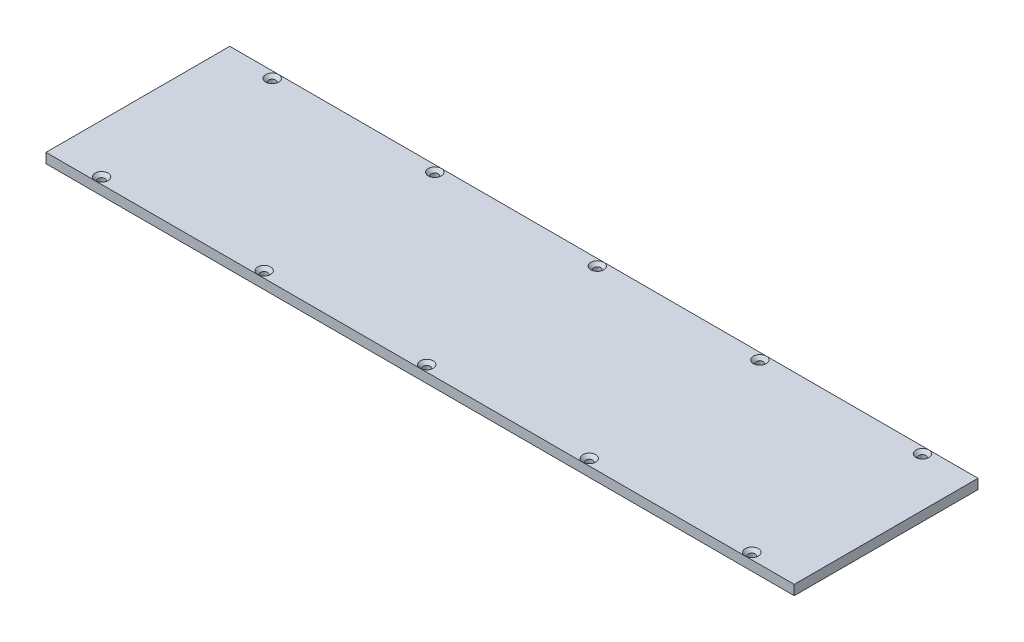
ISO-10303-21;
HEADER;
FILE_DESCRIPTION(('STEP AP214'),'2;1');
FILE_NAME('part.step','',(''),(''),'','','');
FILE_SCHEMA(('AUTOMOTIVE_DESIGN { 1 0 10303 214 1 1 1 1 }'));
ENDSEC;
DATA;
#1=APPLICATION_CONTEXT('core data for automotive mechanical design processes');
#2=APPLICATION_PROTOCOL_DEFINITION('international standard','automotive_design',2000,#1);
#3=PRODUCT_CONTEXT('',#1,'mechanical');
#4=PRODUCT('Part','Part','',(#3));
#5=PRODUCT_RELATED_PRODUCT_CATEGORY('part','',(#4));
#6=PRODUCT_DEFINITION_FORMATION('','',#4);
#7=PRODUCT_DEFINITION_CONTEXT('part definition',#1,'design');
#8=PRODUCT_DEFINITION('design','',#6,#7);
#9=PRODUCT_DEFINITION_SHAPE('','',#8);
#10=(LENGTH_UNIT() NAMED_UNIT(*) SI_UNIT(.MILLI.,.METRE.));
#11=(NAMED_UNIT(*) PLANE_ANGLE_UNIT() SI_UNIT($,.RADIAN.));
#12=(NAMED_UNIT(*) SI_UNIT($,.STERADIAN.) SOLID_ANGLE_UNIT());
#13=UNCERTAINTY_MEASURE_WITH_UNIT(LENGTH_MEASURE(1.E-05),#10,'distance_accuracy_value','');
#14=(GEOMETRIC_REPRESENTATION_CONTEXT(3) GLOBAL_UNCERTAINTY_ASSIGNED_CONTEXT((#13)) GLOBAL_UNIT_ASSIGNED_CONTEXT((#10,
#11,#12)) REPRESENTATION_CONTEXT('',''));
#15=CARTESIAN_POINT('',(0.,0.,0.));
#16=DIRECTION('',(0.,0.,1.));
#17=DIRECTION('',(1.,0.,0.));
#18=AXIS2_PLACEMENT_3D('',#15,#16,#17);
#19=CARTESIAN_POINT('',(361.95,9.525,88.9));
#20=DIRECTION('',(-1.,0.,0.));
#21=DIRECTION('',(0.,0.,1.));
#22=AXIS2_PLACEMENT_3D('',#19,#20,#21);
#23=PLANE('',#22);
#24=DIRECTION('',(0.,0.,-1.));
#25=VECTOR('',#24,1.);
#26=CARTESIAN_POINT('',(361.95,0.,88.9));
#27=LINE('',#26,#25);
#28=CARTESIAN_POINT('',(361.95,0.,88.9));
#29=VERTEX_POINT('',#28);
#30=CARTESIAN_POINT('',(361.95,0.,-88.9));
#31=VERTEX_POINT('',#30);
#32=EDGE_CURVE('E116',#29,#31,#27,.T.);
#33=ORIENTED_EDGE('',*,*,#32,.T.);
#34=DIRECTION('',(0.,-1.,0.));
#35=VECTOR('',#34,1.);
#36=CARTESIAN_POINT('',(361.95,9.525,-88.9));
#37=LINE('',#36,#35);
#38=CARTESIAN_POINT('',(361.95,9.525,-88.9));
#39=VERTEX_POINT('',#38);
#40=EDGE_CURVE('E11',#39,#31,#37,.T.);
#41=ORIENTED_EDGE('',*,*,#40,.F.);
#42=DIRECTION('',(0.,0.,-1.));
#43=VECTOR('',#42,1.);
#44=CARTESIAN_POINT('',(361.95,9.525,88.9));
#45=LINE('',#44,#43);
#46=CARTESIAN_POINT('',(361.95,9.525,88.9));
#47=VERTEX_POINT('',#46);
#48=EDGE_CURVE('E99',#47,#39,#45,.T.);
#49=ORIENTED_EDGE('',*,*,#48,.F.);
#50=DIRECTION('',(0.,-1.,0.));
#51=VECTOR('',#50,1.);
#52=CARTESIAN_POINT('',(361.95,9.525,88.9));
#53=LINE('',#52,#51);
#54=EDGE_CURVE('E112',#47,#29,#53,.T.);
#55=ORIENTED_EDGE('',*,*,#54,.T.);
#56=EDGE_LOOP('',(#33,#41,#49,#55));
#57=FACE_BOUND('',#56,.T.);
#58=ADVANCED_FACE('F47',(#57),#23,.F.);
#59=CARTESIAN_POINT('',(-361.95,9.525,-88.9));
#60=DIRECTION('',(0.,0.,1.));
#61=DIRECTION('',(1.,0.,0.));
#62=AXIS2_PLACEMENT_3D('',#59,#60,#61);
#63=PLANE('',#62);
#64=DIRECTION('',(-1.,0.,0.));
#65=VECTOR('',#64,1.);
#66=CARTESIAN_POINT('',(-361.95,0.,-88.9));
#67=LINE('',#66,#65);
#68=CARTESIAN_POINT('',(-361.95,0.,-88.9));
#69=VERTEX_POINT('',#68);
#70=EDGE_CURVE('E104',#31,#69,#67,.T.);
#71=ORIENTED_EDGE('',*,*,#70,.T.);
#72=DIRECTION('',(0.,-1.,0.));
#73=VECTOR('',#72,1.);
#74=CARTESIAN_POINT('',(-361.95,9.525,-88.9));
#75=LINE('',#74,#73);
#76=CARTESIAN_POINT('',(-361.95,9.525,-88.9));
#77=VERTEX_POINT('',#76);
#78=EDGE_CURVE('E56',#77,#69,#75,.T.);
#79=ORIENTED_EDGE('',*,*,#78,.F.);
#80=DIRECTION('',(-1.,0.,0.));
#81=VECTOR('',#80,1.);
#82=CARTESIAN_POINT('',(-361.95,9.525,-88.9));
#83=LINE('',#82,#81);
#84=EDGE_CURVE('E94',#39,#77,#83,.T.);
#85=ORIENTED_EDGE('',*,*,#84,.F.);
#86=ORIENTED_EDGE('',*,*,#40,.T.);
#87=EDGE_LOOP('',(#71,#79,#85,#86));
#88=FACE_BOUND('',#87,.T.);
#89=ADVANCED_FACE('F103',(#88),#63,.F.);
#90=CARTESIAN_POINT('',(-361.95,9.525,88.9));
#91=DIRECTION('',(1.,0.,0.));
#92=DIRECTION('',(0.,0.,-1.));
#93=AXIS2_PLACEMENT_3D('',#90,#91,#92);
#94=PLANE('',#93);
#95=DIRECTION('',(0.,0.,1.));
#96=VECTOR('',#95,1.);
#97=CARTESIAN_POINT('',(-361.95,0.,88.9));
#98=LINE('',#97,#96);
#99=CARTESIAN_POINT('',(-361.95,0.,88.9));
#100=VERTEX_POINT('',#99);
#101=EDGE_CURVE('E81',#69,#100,#98,.T.);
#102=ORIENTED_EDGE('',*,*,#101,.T.);
#103=DIRECTION('',(0.,-1.,0.));
#104=VECTOR('',#103,1.);
#105=CARTESIAN_POINT('',(-361.95,9.525,88.9));
#106=LINE('',#105,#104);
#107=CARTESIAN_POINT('',(-361.95,9.525,88.9));
#108=VERTEX_POINT('',#107);
#109=EDGE_CURVE('E106',#108,#100,#106,.T.);
#110=ORIENTED_EDGE('',*,*,#109,.F.);
#111=DIRECTION('',(0.,0.,1.));
#112=VECTOR('',#111,1.);
#113=CARTESIAN_POINT('',(-361.95,9.525,88.9));
#114=LINE('',#113,#112);
#115=EDGE_CURVE('E97',#77,#108,#114,.T.);
#116=ORIENTED_EDGE('',*,*,#115,.F.);
#117=ORIENTED_EDGE('',*,*,#78,.T.);
#118=EDGE_LOOP('',(#102,#110,#116,#117));
#119=FACE_BOUND('',#118,.T.);
#120=ADVANCED_FACE('F107',(#119),#94,.F.);
#121=CARTESIAN_POINT('',(-361.95,9.525,88.9));
#122=DIRECTION('',(0.,0.,-1.));
#123=DIRECTION('',(-1.,0.,0.));
#124=AXIS2_PLACEMENT_3D('',#121,#122,#123);
#125=PLANE('',#124);
#126=DIRECTION('',(1.,0.,0.));
#127=VECTOR('',#126,1.);
#128=CARTESIAN_POINT('',(-361.95,0.,88.9));
#129=LINE('',#128,#127);
#130=EDGE_CURVE('E87',#100,#29,#129,.T.);
#131=ORIENTED_EDGE('',*,*,#130,.T.);
#132=ORIENTED_EDGE('',*,*,#54,.F.);
#133=DIRECTION('',(1.,0.,0.));
#134=VECTOR('',#133,1.);
#135=CARTESIAN_POINT('',(-361.95,9.525,88.9));
#136=LINE('',#135,#134);
#137=EDGE_CURVE('E64',#108,#47,#136,.T.);
#138=ORIENTED_EDGE('',*,*,#137,.F.);
#139=ORIENTED_EDGE('',*,*,#109,.T.);
#140=EDGE_LOOP('',(#131,#132,#138,#139));
#141=FACE_BOUND('',#140,.T.);
#142=ADVANCED_FACE('F131',(#141),#125,.F.);
#143=CARTESIAN_POINT('',(0.,9.525,0.));
#144=DIRECTION('',(0.,-1.,0.));
#145=DIRECTION('',(0.,0.,-1.));
#146=AXIS2_PLACEMENT_3D('',#143,#144,#145);
#147=PLANE('',#146);
#148=CARTESIAN_POINT('',(-157.2718,9.525,-82.5500000000001));
#149=DIRECTION('',(0.,1.,0.));
#150=DIRECTION('',(0.,0.,1.));
#151=AXIS2_PLACEMENT_3D('',#148,#149,#150);
#152=CIRCLE('',#151,6.3);
#153=CARTESIAN_POINT('',(-157.2718,9.525,-76.2500000000001));
#154=VERTEX_POINT('',#153);
#155=EDGE_CURVE('E254',#154,#154,#152,.T.);
#156=ORIENTED_EDGE('',*,*,#155,.F.);
#157=EDGE_LOOP('',(#156));
#158=FACE_BOUND('',#157,.T.);
#159=CARTESIAN_POINT('',(157.2718,9.525,-82.5500000000001));
#160=DIRECTION('',(0.,1.,0.));
#161=DIRECTION('',(0.,0.,1.));
#162=AXIS2_PLACEMENT_3D('',#159,#160,#161);
#163=CIRCLE('',#162,6.3);
#164=CARTESIAN_POINT('',(157.2718,9.525,-76.2500000000001));
#165=VERTEX_POINT('',#164);
#166=EDGE_CURVE('E242',#165,#165,#163,.T.);
#167=ORIENTED_EDGE('',*,*,#166,.F.);
#168=EDGE_LOOP('',(#167));
#169=FACE_BOUND('',#168,.T.);
#170=CARTESIAN_POINT('',(-157.2718,9.525,82.5500000000001));
#171=DIRECTION('',(0.,1.,0.));
#172=DIRECTION('',(0.,0.,1.));
#173=AXIS2_PLACEMENT_3D('',#170,#171,#172);
#174=CIRCLE('',#173,6.3);
#175=CARTESIAN_POINT('',(-157.2718,9.525,88.8500000000001));
#176=VERTEX_POINT('',#175);
#177=EDGE_CURVE('E230',#176,#176,#174,.T.);
#178=ORIENTED_EDGE('',*,*,#177,.F.);
#179=EDGE_LOOP('',(#178));
#180=FACE_BOUND('',#179,.T.);
#181=CARTESIAN_POINT('',(157.2718,9.525,82.5500000000001));
#182=DIRECTION('',(0.,1.,0.));
#183=DIRECTION('',(0.,0.,1.));
#184=AXIS2_PLACEMENT_3D('',#181,#182,#183);
#185=CIRCLE('',#184,6.3);
#186=CARTESIAN_POINT('',(157.2718,9.525,88.8500000000001));
#187=VERTEX_POINT('',#186);
#188=EDGE_CURVE('E218',#187,#187,#185,.T.);
#189=ORIENTED_EDGE('',*,*,#188,.F.);
#190=EDGE_LOOP('',(#189));
#191=FACE_BOUND('',#190,.T.);
#192=CARTESIAN_POINT('',(314.5436,9.525,82.55));
#193=DIRECTION('',(0.,1.,0.));
#194=DIRECTION('',(0.,0.,1.));
#195=AXIS2_PLACEMENT_3D('',#192,#193,#194);
#196=CIRCLE('',#195,6.30000000000003);
#197=CARTESIAN_POINT('',(314.5436,9.525,88.85));
#198=VERTEX_POINT('',#197);
#199=EDGE_CURVE('E206',#198,#198,#196,.T.);
#200=ORIENTED_EDGE('',*,*,#199,.F.);
#201=EDGE_LOOP('',(#200));
#202=FACE_BOUND('',#201,.T.);
#203=CARTESIAN_POINT('',(-314.5436,9.525,-82.55));
#204=DIRECTION('',(0.,1.,0.));
#205=DIRECTION('',(0.,0.,1.));
#206=AXIS2_PLACEMENT_3D('',#203,#204,#205);
#207=CIRCLE('',#206,6.30000000000003);
#208=CARTESIAN_POINT('',(-314.5436,9.525,-76.25));
#209=VERTEX_POINT('',#208);
#210=EDGE_CURVE('E194',#209,#209,#207,.T.);
#211=ORIENTED_EDGE('',*,*,#210,.F.);
#212=EDGE_LOOP('',(#211));
#213=FACE_BOUND('',#212,.T.);
#214=CARTESIAN_POINT('',(-314.5436,9.525,82.55));
#215=DIRECTION('',(0.,1.,0.));
#216=DIRECTION('',(0.,0.,1.));
#217=AXIS2_PLACEMENT_3D('',#214,#215,#216);
#218=CIRCLE('',#217,6.30000000000003);
#219=CARTESIAN_POINT('',(-314.5436,9.525,88.85));
#220=VERTEX_POINT('',#219);
#221=EDGE_CURVE('E182',#220,#220,#218,.T.);
#222=ORIENTED_EDGE('',*,*,#221,.F.);
#223=EDGE_LOOP('',(#222));
#224=FACE_BOUND('',#223,.T.);
#225=CARTESIAN_POINT('',(0.,9.525,82.55));
#226=DIRECTION('',(0.,1.,0.));
#227=DIRECTION('',(0.,0.,1.));
#228=AXIS2_PLACEMENT_3D('',#225,#226,#227);
#229=CIRCLE('',#228,6.3);
#230=CARTESIAN_POINT('',(0.,9.525,88.85));
#231=VERTEX_POINT('',#230);
#232=EDGE_CURVE('E170',#231,#231,#229,.T.);
#233=ORIENTED_EDGE('',*,*,#232,.F.);
#234=EDGE_LOOP('',(#233));
#235=FACE_BOUND('',#234,.T.);
#236=CARTESIAN_POINT('',(0.,9.525,-82.55));
#237=DIRECTION('',(0.,1.,0.));
#238=DIRECTION('',(0.,0.,1.));
#239=AXIS2_PLACEMENT_3D('',#236,#237,#238);
#240=CIRCLE('',#239,6.3);
#241=CARTESIAN_POINT('',(0.,9.525,-76.25));
#242=VERTEX_POINT('',#241);
#243=EDGE_CURVE('E158',#242,#242,#240,.T.);
#244=ORIENTED_EDGE('',*,*,#243,.F.);
#245=EDGE_LOOP('',(#244));
#246=FACE_BOUND('',#245,.T.);
#247=CARTESIAN_POINT('',(314.5436,9.525,-82.55));
#248=DIRECTION('',(0.,1.,0.));
#249=DIRECTION('',(0.,0.,1.));
#250=AXIS2_PLACEMENT_3D('',#247,#248,#249);
#251=CIRCLE('',#250,6.30000000000003);
#252=CARTESIAN_POINT('',(314.5436,9.525,-76.25));
#253=VERTEX_POINT('',#252);
#254=EDGE_CURVE('E146',#253,#253,#251,.T.);
#255=ORIENTED_EDGE('',*,*,#254,.F.);
#256=EDGE_LOOP('',(#255));
#257=FACE_BOUND('',#256,.T.);
#258=ORIENTED_EDGE('',*,*,#48,.T.);
#259=ORIENTED_EDGE('',*,*,#84,.T.);
#260=ORIENTED_EDGE('',*,*,#115,.T.);
#261=ORIENTED_EDGE('',*,*,#137,.T.);
#262=EDGE_LOOP('',(#258,#259,#260,#261));
#263=FACE_BOUND('',#262,.T.);
#264=ADVANCED_FACE('F95',(#158,#169,#180,#191,#202,#213,#224,#235,#246,#257,#263),#147,.F.);
#265=CARTESIAN_POINT('',(0.,0.,0.));
#266=DIRECTION('',(0.,-1.,0.));
#267=DIRECTION('',(0.,0.,-1.));
#268=AXIS2_PLACEMENT_3D('',#265,#266,#267);
#269=PLANE('',#268);
#270=CARTESIAN_POINT('',(-157.2718,0.,-82.5500000000001));
#271=DIRECTION('',(0.,1.,0.));
#272=DIRECTION('',(0.,0.,1.));
#273=AXIS2_PLACEMENT_3D('',#270,#271,#272);
#274=CIRCLE('',#273,3.3);
#275=CARTESIAN_POINT('',(-157.2718,0.,-79.2500000000001));
#276=VERTEX_POINT('',#275);
#277=EDGE_CURVE('E246',#276,#276,#274,.T.);
#278=ORIENTED_EDGE('',*,*,#277,.T.);
#279=EDGE_LOOP('',(#278));
#280=FACE_BOUND('',#279,.T.);
#281=CARTESIAN_POINT('',(157.2718,0.,-82.5500000000001));
#282=DIRECTION('',(0.,1.,0.));
#283=DIRECTION('',(0.,0.,1.));
#284=AXIS2_PLACEMENT_3D('',#281,#282,#283);
#285=CIRCLE('',#284,3.3);
#286=CARTESIAN_POINT('',(157.2718,0.,-79.2500000000001));
#287=VERTEX_POINT('',#286);
#288=EDGE_CURVE('E234',#287,#287,#285,.T.);
#289=ORIENTED_EDGE('',*,*,#288,.T.);
#290=EDGE_LOOP('',(#289));
#291=FACE_BOUND('',#290,.T.);
#292=CARTESIAN_POINT('',(-157.2718,0.,82.5500000000001));
#293=DIRECTION('',(0.,1.,0.));
#294=DIRECTION('',(0.,0.,1.));
#295=AXIS2_PLACEMENT_3D('',#292,#293,#294);
#296=CIRCLE('',#295,3.3);
#297=CARTESIAN_POINT('',(-157.2718,0.,85.8500000000001));
#298=VERTEX_POINT('',#297);
#299=EDGE_CURVE('E222',#298,#298,#296,.T.);
#300=ORIENTED_EDGE('',*,*,#299,.T.);
#301=EDGE_LOOP('',(#300));
#302=FACE_BOUND('',#301,.T.);
#303=CARTESIAN_POINT('',(157.2718,0.,82.5500000000001));
#304=DIRECTION('',(0.,1.,0.));
#305=DIRECTION('',(0.,0.,1.));
#306=AXIS2_PLACEMENT_3D('',#303,#304,#305);
#307=CIRCLE('',#306,3.3);
#308=CARTESIAN_POINT('',(157.2718,0.,85.8500000000001));
#309=VERTEX_POINT('',#308);
#310=EDGE_CURVE('E210',#309,#309,#307,.T.);
#311=ORIENTED_EDGE('',*,*,#310,.T.);
#312=EDGE_LOOP('',(#311));
#313=FACE_BOUND('',#312,.T.);
#314=CARTESIAN_POINT('',(314.5436,0.,82.55));
#315=DIRECTION('',(0.,1.,0.));
#316=DIRECTION('',(0.,0.,1.));
#317=AXIS2_PLACEMENT_3D('',#314,#315,#316);
#318=CIRCLE('',#317,3.30000000000003);
#319=CARTESIAN_POINT('',(314.5436,0.,85.85));
#320=VERTEX_POINT('',#319);
#321=EDGE_CURVE('E198',#320,#320,#318,.T.);
#322=ORIENTED_EDGE('',*,*,#321,.T.);
#323=EDGE_LOOP('',(#322));
#324=FACE_BOUND('',#323,.T.);
#325=CARTESIAN_POINT('',(-314.5436,0.,-82.55));
#326=DIRECTION('',(0.,1.,0.));
#327=DIRECTION('',(0.,0.,1.));
#328=AXIS2_PLACEMENT_3D('',#325,#326,#327);
#329=CIRCLE('',#328,3.30000000000003);
#330=CARTESIAN_POINT('',(-314.5436,0.,-79.25));
#331=VERTEX_POINT('',#330);
#332=EDGE_CURVE('E186',#331,#331,#329,.T.);
#333=ORIENTED_EDGE('',*,*,#332,.T.);
#334=EDGE_LOOP('',(#333));
#335=FACE_BOUND('',#334,.T.);
#336=CARTESIAN_POINT('',(-314.5436,0.,82.55));
#337=DIRECTION('',(0.,1.,0.));
#338=DIRECTION('',(0.,0.,1.));
#339=AXIS2_PLACEMENT_3D('',#336,#337,#338);
#340=CIRCLE('',#339,3.30000000000003);
#341=CARTESIAN_POINT('',(-314.5436,0.,85.85));
#342=VERTEX_POINT('',#341);
#343=EDGE_CURVE('E174',#342,#342,#340,.T.);
#344=ORIENTED_EDGE('',*,*,#343,.T.);
#345=EDGE_LOOP('',(#344));
#346=FACE_BOUND('',#345,.T.);
#347=CARTESIAN_POINT('',(0.,0.,82.55));
#348=DIRECTION('',(0.,1.,0.));
#349=DIRECTION('',(0.,0.,1.));
#350=AXIS2_PLACEMENT_3D('',#347,#348,#349);
#351=CIRCLE('',#350,3.3);
#352=CARTESIAN_POINT('',(0.,0.,85.85));
#353=VERTEX_POINT('',#352);
#354=EDGE_CURVE('E162',#353,#353,#351,.T.);
#355=ORIENTED_EDGE('',*,*,#354,.T.);
#356=EDGE_LOOP('',(#355));
#357=FACE_BOUND('',#356,.T.);
#358=CARTESIAN_POINT('',(0.,0.,-82.55));
#359=DIRECTION('',(0.,1.,0.));
#360=DIRECTION('',(0.,0.,1.));
#361=AXIS2_PLACEMENT_3D('',#358,#359,#360);
#362=CIRCLE('',#361,3.3);
#363=CARTESIAN_POINT('',(0.,0.,-79.25));
#364=VERTEX_POINT('',#363);
#365=EDGE_CURVE('E150',#364,#364,#362,.T.);
#366=ORIENTED_EDGE('',*,*,#365,.T.);
#367=EDGE_LOOP('',(#366));
#368=FACE_BOUND('',#367,.T.);
#369=CARTESIAN_POINT('',(314.5436,0.,-82.55));
#370=DIRECTION('',(0.,1.,0.));
#371=DIRECTION('',(0.,0.,1.));
#372=AXIS2_PLACEMENT_3D('',#369,#370,#371);
#373=CIRCLE('',#372,3.30000000000003);
#374=CARTESIAN_POINT('',(314.5436,0.,-79.25));
#375=VERTEX_POINT('',#374);
#376=EDGE_CURVE('E120',#375,#375,#373,.T.);
#377=ORIENTED_EDGE('',*,*,#376,.T.);
#378=EDGE_LOOP('',(#377));
#379=FACE_BOUND('',#378,.T.);
#380=ORIENTED_EDGE('',*,*,#32,.F.);
#381=ORIENTED_EDGE('',*,*,#130,.F.);
#382=ORIENTED_EDGE('',*,*,#101,.F.);
#383=ORIENTED_EDGE('',*,*,#70,.F.);
#384=EDGE_LOOP('',(#380,#381,#382,#383));
#385=FACE_BOUND('',#384,.T.);
#386=ADVANCED_FACE('F134',(#280,#291,#302,#313,#324,#335,#346,#357,#368,#379,#385),#269,.T.);
#387=CARTESIAN_POINT('',(314.5436,9.525,-82.55));
#388=DIRECTION('',(0.,1.,0.));
#389=DIRECTION('',(0.,0.,1.));
#390=AXIS2_PLACEMENT_3D('',#387,#388,#389);
#391=CYLINDRICAL_SURFACE('',#390,3.30000000000003);
#392=ORIENTED_EDGE('',*,*,#376,.F.);
#393=EDGE_LOOP('',(#392));
#394=FACE_BOUND('',#393,.T.);
#395=CARTESIAN_POINT('',(314.5436,6.525,-82.55));
#396=DIRECTION('',(0.,1.,0.));
#397=DIRECTION('',(0.,0.,1.));
#398=AXIS2_PLACEMENT_3D('',#395,#396,#397);
#399=CIRCLE('',#398,3.30000000000003);
#400=CARTESIAN_POINT('',(314.5436,6.525,-79.25));
#401=VERTEX_POINT('',#400);
#402=EDGE_CURVE('E142',#401,#401,#399,.T.);
#403=ORIENTED_EDGE('',*,*,#402,.T.);
#404=EDGE_LOOP('',(#403));
#405=FACE_BOUND('',#404,.T.);
#406=ADVANCED_FACE('F286',(#394,#405),#391,.F.);
#407=CARTESIAN_POINT('',(314.5436,9.525,-82.55));
#408=DIRECTION('',(0.,1.,0.));
#409=DIRECTION('',(0.,0.,1.));
#410=AXIS2_PLACEMENT_3D('',#407,#408,#409);
#411=CONICAL_SURFACE('',#410,6.30000000000003,0.785398163397448);
#412=ORIENTED_EDGE('',*,*,#402,.F.);
#413=EDGE_LOOP('',(#412));
#414=FACE_BOUND('',#413,.T.);
#415=ORIENTED_EDGE('',*,*,#254,.T.);
#416=EDGE_LOOP('',(#415));
#417=FACE_BOUND('',#416,.T.);
#418=ADVANCED_FACE('F283',(#414,#417),#411,.F.);
#419=CARTESIAN_POINT('',(0.,9.525,-82.55));
#420=DIRECTION('',(0.,1.,0.));
#421=DIRECTION('',(0.,0.,1.));
#422=AXIS2_PLACEMENT_3D('',#419,#420,#421);
#423=CYLINDRICAL_SURFACE('',#422,3.3);
#424=ORIENTED_EDGE('',*,*,#365,.F.);
#425=EDGE_LOOP('',(#424));
#426=FACE_BOUND('',#425,.T.);
#427=CARTESIAN_POINT('',(0.,6.525,-82.55));
#428=DIRECTION('',(0.,1.,0.));
#429=DIRECTION('',(0.,0.,1.));
#430=AXIS2_PLACEMENT_3D('',#427,#428,#429);
#431=CIRCLE('',#430,3.3);
#432=CARTESIAN_POINT('',(0.,6.525,-79.25));
#433=VERTEX_POINT('',#432);
#434=EDGE_CURVE('E154',#433,#433,#431,.T.);
#435=ORIENTED_EDGE('',*,*,#434,.T.);
#436=EDGE_LOOP('',(#435));
#437=FACE_BOUND('',#436,.T.);
#438=ADVANCED_FACE('F285',(#426,#437),#423,.F.);
#439=CARTESIAN_POINT('',(0.,9.525,-82.55));
#440=DIRECTION('',(0.,1.,0.));
#441=DIRECTION('',(0.,0.,1.));
#442=AXIS2_PLACEMENT_3D('',#439,#440,#441);
#443=CONICAL_SURFACE('',#442,6.3,0.785398163397448);
#444=ORIENTED_EDGE('',*,*,#434,.F.);
#445=EDGE_LOOP('',(#444));
#446=FACE_BOUND('',#445,.T.);
#447=ORIENTED_EDGE('',*,*,#243,.T.);
#448=EDGE_LOOP('',(#447));
#449=FACE_BOUND('',#448,.T.);
#450=ADVANCED_FACE('F293',(#446,#449),#443,.F.);
#451=CARTESIAN_POINT('',(0.,9.525,82.55));
#452=DIRECTION('',(0.,1.,0.));
#453=DIRECTION('',(0.,0.,1.));
#454=AXIS2_PLACEMENT_3D('',#451,#452,#453);
#455=CYLINDRICAL_SURFACE('',#454,3.3);
#456=ORIENTED_EDGE('',*,*,#354,.F.);
#457=EDGE_LOOP('',(#456));
#458=FACE_BOUND('',#457,.T.);
#459=CARTESIAN_POINT('',(0.,6.525,82.55));
#460=DIRECTION('',(0.,1.,0.));
#461=DIRECTION('',(0.,0.,1.));
#462=AXIS2_PLACEMENT_3D('',#459,#460,#461);
#463=CIRCLE('',#462,3.3);
#464=CARTESIAN_POINT('',(0.,6.525,85.85));
#465=VERTEX_POINT('',#464);
#466=EDGE_CURVE('E166',#465,#465,#463,.T.);
#467=ORIENTED_EDGE('',*,*,#466,.T.);
#468=EDGE_LOOP('',(#467));
#469=FACE_BOUND('',#468,.T.);
#470=ADVANCED_FACE('F340',(#458,#469),#455,.F.);
#471=CARTESIAN_POINT('',(0.,9.525,82.55));
#472=DIRECTION('',(0.,1.,0.));
#473=DIRECTION('',(0.,0.,1.));
#474=AXIS2_PLACEMENT_3D('',#471,#472,#473);
#475=CONICAL_SURFACE('',#474,6.3,0.785398163397448);
#476=ORIENTED_EDGE('',*,*,#466,.F.);
#477=EDGE_LOOP('',(#476));
#478=FACE_BOUND('',#477,.T.);
#479=ORIENTED_EDGE('',*,*,#232,.T.);
#480=EDGE_LOOP('',(#479));
#481=FACE_BOUND('',#480,.T.);
#482=ADVANCED_FACE('F345',(#478,#481),#475,.F.);
#483=CARTESIAN_POINT('',(-314.5436,9.525,82.55));
#484=DIRECTION('',(0.,1.,0.));
#485=DIRECTION('',(0.,0.,1.));
#486=AXIS2_PLACEMENT_3D('',#483,#484,#485);
#487=CYLINDRICAL_SURFACE('',#486,3.30000000000003);
#488=ORIENTED_EDGE('',*,*,#343,.F.);
#489=EDGE_LOOP('',(#488));
#490=FACE_BOUND('',#489,.T.);
#491=CARTESIAN_POINT('',(-314.5436,6.525,82.55));
#492=DIRECTION('',(0.,1.,0.));
#493=DIRECTION('',(0.,0.,1.));
#494=AXIS2_PLACEMENT_3D('',#491,#492,#493);
#495=CIRCLE('',#494,3.30000000000003);
#496=CARTESIAN_POINT('',(-314.5436,6.525,85.85));
#497=VERTEX_POINT('',#496);
#498=EDGE_CURVE('E178',#497,#497,#495,.T.);
#499=ORIENTED_EDGE('',*,*,#498,.T.);
#500=EDGE_LOOP('',(#499));
#501=FACE_BOUND('',#500,.T.);
#502=ADVANCED_FACE('F351',(#490,#501),#487,.F.);
#503=CARTESIAN_POINT('',(-314.5436,9.525,82.55));
#504=DIRECTION('',(0.,1.,0.));
#505=DIRECTION('',(0.,0.,1.));
#506=AXIS2_PLACEMENT_3D('',#503,#504,#505);
#507=CONICAL_SURFACE('',#506,6.30000000000003,0.785398163397448);
#508=ORIENTED_EDGE('',*,*,#498,.F.);
#509=EDGE_LOOP('',(#508));
#510=FACE_BOUND('',#509,.T.);
#511=ORIENTED_EDGE('',*,*,#221,.T.);
#512=EDGE_LOOP('',(#511));
#513=FACE_BOUND('',#512,.T.);
#514=ADVANCED_FACE('F355',(#510,#513),#507,.F.);
#515=CARTESIAN_POINT('',(-314.5436,9.525,-82.55));
#516=DIRECTION('',(0.,1.,0.));
#517=DIRECTION('',(0.,0.,1.));
#518=AXIS2_PLACEMENT_3D('',#515,#516,#517);
#519=CYLINDRICAL_SURFACE('',#518,3.30000000000003);
#520=ORIENTED_EDGE('',*,*,#332,.F.);
#521=EDGE_LOOP('',(#520));
#522=FACE_BOUND('',#521,.T.);
#523=CARTESIAN_POINT('',(-314.5436,6.525,-82.55));
#524=DIRECTION('',(0.,1.,0.));
#525=DIRECTION('',(0.,0.,1.));
#526=AXIS2_PLACEMENT_3D('',#523,#524,#525);
#527=CIRCLE('',#526,3.30000000000003);
#528=CARTESIAN_POINT('',(-314.5436,6.525,-79.25));
#529=VERTEX_POINT('',#528);
#530=EDGE_CURVE('E190',#529,#529,#527,.T.);
#531=ORIENTED_EDGE('',*,*,#530,.T.);
#532=EDGE_LOOP('',(#531));
#533=FACE_BOUND('',#532,.T.);
#534=ADVANCED_FACE('F359',(#522,#533),#519,.F.);
#535=CARTESIAN_POINT('',(-314.5436,9.525,-82.55));
#536=DIRECTION('',(0.,1.,0.));
#537=DIRECTION('',(0.,0.,1.));
#538=AXIS2_PLACEMENT_3D('',#535,#536,#537);
#539=CONICAL_SURFACE('',#538,6.30000000000003,0.785398163397448);
#540=ORIENTED_EDGE('',*,*,#530,.F.);
#541=EDGE_LOOP('',(#540));
#542=FACE_BOUND('',#541,.T.);
#543=ORIENTED_EDGE('',*,*,#210,.T.);
#544=EDGE_LOOP('',(#543));
#545=FACE_BOUND('',#544,.T.);
#546=ADVANCED_FACE('F363',(#542,#545),#539,.F.);
#547=CARTESIAN_POINT('',(314.5436,9.525,82.55));
#548=DIRECTION('',(0.,1.,0.));
#549=DIRECTION('',(0.,0.,1.));
#550=AXIS2_PLACEMENT_3D('',#547,#548,#549);
#551=CYLINDRICAL_SURFACE('',#550,3.30000000000003);
#552=ORIENTED_EDGE('',*,*,#321,.F.);
#553=EDGE_LOOP('',(#552));
#554=FACE_BOUND('',#553,.T.);
#555=CARTESIAN_POINT('',(314.5436,6.525,82.55));
#556=DIRECTION('',(0.,1.,0.));
#557=DIRECTION('',(0.,0.,1.));
#558=AXIS2_PLACEMENT_3D('',#555,#556,#557);
#559=CIRCLE('',#558,3.30000000000003);
#560=CARTESIAN_POINT('',(314.5436,6.525,85.85));
#561=VERTEX_POINT('',#560);
#562=EDGE_CURVE('E202',#561,#561,#559,.T.);
#563=ORIENTED_EDGE('',*,*,#562,.T.);
#564=EDGE_LOOP('',(#563));
#565=FACE_BOUND('',#564,.T.);
#566=ADVANCED_FACE('F367',(#554,#565),#551,.F.);
#567=CARTESIAN_POINT('',(314.5436,9.525,82.55));
#568=DIRECTION('',(0.,1.,0.));
#569=DIRECTION('',(0.,0.,1.));
#570=AXIS2_PLACEMENT_3D('',#567,#568,#569);
#571=CONICAL_SURFACE('',#570,6.30000000000003,0.785398163397448);
#572=ORIENTED_EDGE('',*,*,#562,.F.);
#573=EDGE_LOOP('',(#572));
#574=FACE_BOUND('',#573,.T.);
#575=ORIENTED_EDGE('',*,*,#199,.T.);
#576=EDGE_LOOP('',(#575));
#577=FACE_BOUND('',#576,.T.);
#578=ADVANCED_FACE('F371',(#574,#577),#571,.F.);
#579=CARTESIAN_POINT('',(157.2718,9.525,82.5500000000001));
#580=DIRECTION('',(0.,1.,0.));
#581=DIRECTION('',(0.,0.,1.));
#582=AXIS2_PLACEMENT_3D('',#579,#580,#581);
#583=CYLINDRICAL_SURFACE('',#582,3.3);
#584=ORIENTED_EDGE('',*,*,#310,.F.);
#585=EDGE_LOOP('',(#584));
#586=FACE_BOUND('',#585,.T.);
#587=CARTESIAN_POINT('',(157.2718,6.525,82.5500000000001));
#588=DIRECTION('',(0.,1.,0.));
#589=DIRECTION('',(0.,0.,1.));
#590=AXIS2_PLACEMENT_3D('',#587,#588,#589);
#591=CIRCLE('',#590,3.3);
#592=CARTESIAN_POINT('',(157.2718,6.525,85.8500000000001));
#593=VERTEX_POINT('',#592);
#594=EDGE_CURVE('E214',#593,#593,#591,.T.);
#595=ORIENTED_EDGE('',*,*,#594,.T.);
#596=EDGE_LOOP('',(#595));
#597=FACE_BOUND('',#596,.T.);
#598=ADVANCED_FACE('F375',(#586,#597),#583,.F.);
#599=CARTESIAN_POINT('',(157.2718,9.525,82.5500000000001));
#600=DIRECTION('',(0.,1.,0.));
#601=DIRECTION('',(0.,0.,1.));
#602=AXIS2_PLACEMENT_3D('',#599,#600,#601);
#603=CONICAL_SURFACE('',#602,6.3,0.785398163397448);
#604=ORIENTED_EDGE('',*,*,#594,.F.);
#605=EDGE_LOOP('',(#604));
#606=FACE_BOUND('',#605,.T.);
#607=ORIENTED_EDGE('',*,*,#188,.T.);
#608=EDGE_LOOP('',(#607));
#609=FACE_BOUND('',#608,.T.);
#610=ADVANCED_FACE('F379',(#606,#609),#603,.F.);
#611=CARTESIAN_POINT('',(-157.2718,9.525,82.5500000000001));
#612=DIRECTION('',(0.,1.,0.));
#613=DIRECTION('',(0.,0.,1.));
#614=AXIS2_PLACEMENT_3D('',#611,#612,#613);
#615=CYLINDRICAL_SURFACE('',#614,3.3);
#616=ORIENTED_EDGE('',*,*,#299,.F.);
#617=EDGE_LOOP('',(#616));
#618=FACE_BOUND('',#617,.T.);
#619=CARTESIAN_POINT('',(-157.2718,6.525,82.5500000000001));
#620=DIRECTION('',(0.,1.,0.));
#621=DIRECTION('',(0.,0.,1.));
#622=AXIS2_PLACEMENT_3D('',#619,#620,#621);
#623=CIRCLE('',#622,3.3);
#624=CARTESIAN_POINT('',(-157.2718,6.525,85.8500000000001));
#625=VERTEX_POINT('',#624);
#626=EDGE_CURVE('E226',#625,#625,#623,.T.);
#627=ORIENTED_EDGE('',*,*,#626,.T.);
#628=EDGE_LOOP('',(#627));
#629=FACE_BOUND('',#628,.T.);
#630=ADVANCED_FACE('F383',(#618,#629),#615,.F.);
#631=CARTESIAN_POINT('',(-157.2718,9.525,82.5500000000001));
#632=DIRECTION('',(0.,1.,0.));
#633=DIRECTION('',(0.,0.,1.));
#634=AXIS2_PLACEMENT_3D('',#631,#632,#633);
#635=CONICAL_SURFACE('',#634,6.3,0.785398163397448);
#636=ORIENTED_EDGE('',*,*,#626,.F.);
#637=EDGE_LOOP('',(#636));
#638=FACE_BOUND('',#637,.T.);
#639=ORIENTED_EDGE('',*,*,#177,.T.);
#640=EDGE_LOOP('',(#639));
#641=FACE_BOUND('',#640,.T.);
#642=ADVANCED_FACE('F387',(#638,#641),#635,.F.);
#643=CARTESIAN_POINT('',(157.2718,9.525,-82.5500000000001));
#644=DIRECTION('',(0.,1.,0.));
#645=DIRECTION('',(0.,0.,1.));
#646=AXIS2_PLACEMENT_3D('',#643,#644,#645);
#647=CYLINDRICAL_SURFACE('',#646,3.3);
#648=ORIENTED_EDGE('',*,*,#288,.F.);
#649=EDGE_LOOP('',(#648));
#650=FACE_BOUND('',#649,.T.);
#651=CARTESIAN_POINT('',(157.2718,6.525,-82.5500000000001));
#652=DIRECTION('',(0.,1.,0.));
#653=DIRECTION('',(0.,0.,1.));
#654=AXIS2_PLACEMENT_3D('',#651,#652,#653);
#655=CIRCLE('',#654,3.3);
#656=CARTESIAN_POINT('',(157.2718,6.525,-79.2500000000001));
#657=VERTEX_POINT('',#656);
#658=EDGE_CURVE('E238',#657,#657,#655,.T.);
#659=ORIENTED_EDGE('',*,*,#658,.T.);
#660=EDGE_LOOP('',(#659));
#661=FACE_BOUND('',#660,.T.);
#662=ADVANCED_FACE('F391',(#650,#661),#647,.F.);
#663=CARTESIAN_POINT('',(157.2718,9.525,-82.5500000000001));
#664=DIRECTION('',(0.,1.,0.));
#665=DIRECTION('',(0.,0.,1.));
#666=AXIS2_PLACEMENT_3D('',#663,#664,#665);
#667=CONICAL_SURFACE('',#666,6.3,0.785398163397448);
#668=ORIENTED_EDGE('',*,*,#658,.F.);
#669=EDGE_LOOP('',(#668));
#670=FACE_BOUND('',#669,.T.);
#671=ORIENTED_EDGE('',*,*,#166,.T.);
#672=EDGE_LOOP('',(#671));
#673=FACE_BOUND('',#672,.T.);
#674=ADVANCED_FACE('F395',(#670,#673),#667,.F.);
#675=CARTESIAN_POINT('',(-157.2718,9.525,-82.5500000000001));
#676=DIRECTION('',(0.,1.,0.));
#677=DIRECTION('',(0.,0.,1.));
#678=AXIS2_PLACEMENT_3D('',#675,#676,#677);
#679=CYLINDRICAL_SURFACE('',#678,3.3);
#680=ORIENTED_EDGE('',*,*,#277,.F.);
#681=EDGE_LOOP('',(#680));
#682=FACE_BOUND('',#681,.T.);
#683=CARTESIAN_POINT('',(-157.2718,6.525,-82.5500000000001));
#684=DIRECTION('',(0.,1.,0.));
#685=DIRECTION('',(0.,0.,1.));
#686=AXIS2_PLACEMENT_3D('',#683,#684,#685);
#687=CIRCLE('',#686,3.3);
#688=CARTESIAN_POINT('',(-157.2718,6.525,-79.2500000000001));
#689=VERTEX_POINT('',#688);
#690=EDGE_CURVE('E250',#689,#689,#687,.T.);
#691=ORIENTED_EDGE('',*,*,#690,.T.);
#692=EDGE_LOOP('',(#691));
#693=FACE_BOUND('',#692,.T.);
#694=ADVANCED_FACE('F399',(#682,#693),#679,.F.);
#695=CARTESIAN_POINT('',(-157.2718,9.525,-82.5500000000001));
#696=DIRECTION('',(0.,1.,0.));
#697=DIRECTION('',(0.,0.,1.));
#698=AXIS2_PLACEMENT_3D('',#695,#696,#697);
#699=CONICAL_SURFACE('',#698,6.3,0.785398163397448);
#700=ORIENTED_EDGE('',*,*,#690,.F.);
#701=EDGE_LOOP('',(#700));
#702=FACE_BOUND('',#701,.T.);
#703=ORIENTED_EDGE('',*,*,#155,.T.);
#704=EDGE_LOOP('',(#703));
#705=FACE_BOUND('',#704,.T.);
#706=ADVANCED_FACE('F260',(#702,#705),#699,.F.);
#707=CLOSED_SHELL('',(#58,#89,#120,#142,#264,#386,#406,#418,#438,#450,#470,#482,#502,#514,#534,
#546,#566,#578,#598,#610,#630,#642,#662,#674,#694,#706));
#708=MANIFOLD_SOLID_BREP('B2',#707);
#709=ADVANCED_BREP_SHAPE_REPRESENTATION('',(#18,#708),#14);
#710=SHAPE_DEFINITION_REPRESENTATION(#9,#709);
ENDSEC;
END-ISO-10303-21;
